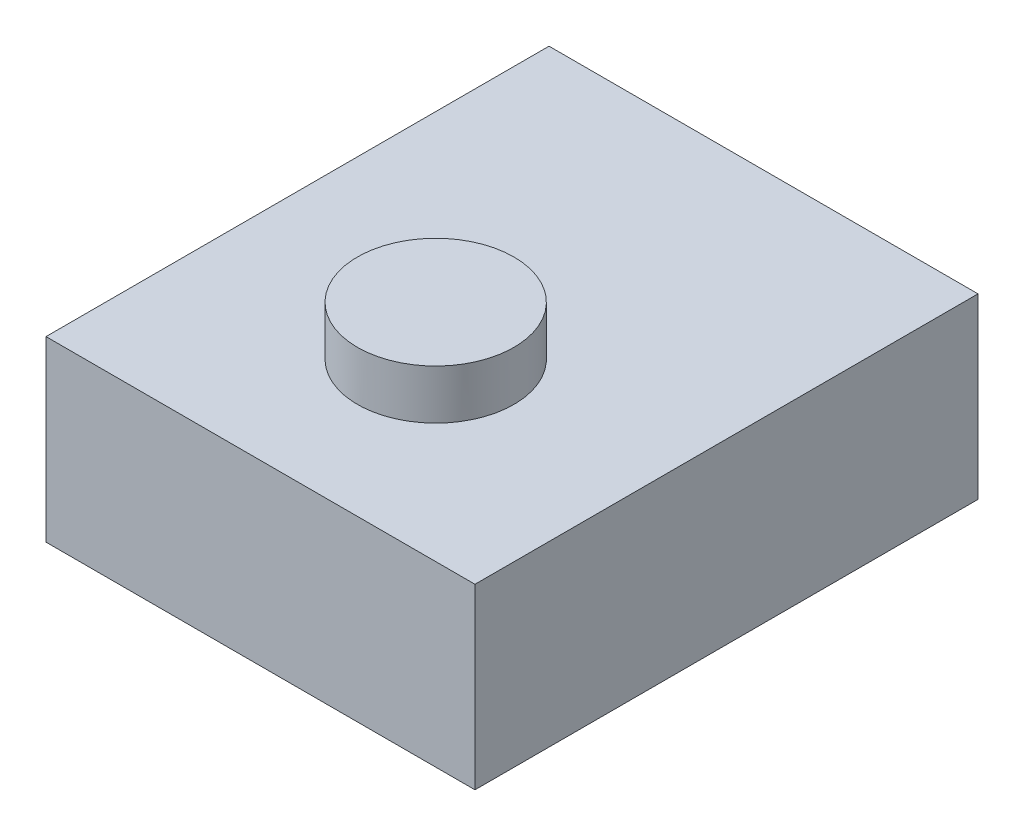
ISO-10303-21;
HEADER;
FILE_DESCRIPTION(('STEP AP214'),'2;1');
FILE_NAME('part.step','',(''),(''),'','','');
FILE_SCHEMA(('AUTOMOTIVE_DESIGN { 1 0 10303 214 1 1 1 1 }'));
ENDSEC;
DATA;
#1=APPLICATION_CONTEXT('core data for automotive mechanical design processes');
#2=APPLICATION_PROTOCOL_DEFINITION('international standard','automotive_design',2000,#1);
#3=PRODUCT_CONTEXT('',#1,'mechanical');
#4=PRODUCT('Part','Part','',(#3));
#5=PRODUCT_RELATED_PRODUCT_CATEGORY('part','',(#4));
#6=PRODUCT_DEFINITION_FORMATION('','',#4);
#7=PRODUCT_DEFINITION_CONTEXT('part definition',#1,'design');
#8=PRODUCT_DEFINITION('design','',#6,#7);
#9=PRODUCT_DEFINITION_SHAPE('','',#8);
#10=(LENGTH_UNIT() NAMED_UNIT(*) SI_UNIT(.MILLI.,.METRE.));
#11=(NAMED_UNIT(*) PLANE_ANGLE_UNIT() SI_UNIT($,.RADIAN.));
#12=(NAMED_UNIT(*) SI_UNIT($,.STERADIAN.) SOLID_ANGLE_UNIT());
#13=UNCERTAINTY_MEASURE_WITH_UNIT(LENGTH_MEASURE(1.E-05),#10,'distance_accuracy_value','');
#14=(GEOMETRIC_REPRESENTATION_CONTEXT(3) GLOBAL_UNCERTAINTY_ASSIGNED_CONTEXT((#13)) GLOBAL_UNIT_ASSIGNED_CONTEXT((#10,
#11,#12)) REPRESENTATION_CONTEXT('',''));
#15=CARTESIAN_POINT('',(0.,0.,0.));
#16=DIRECTION('',(0.,0.,1.));
#17=DIRECTION('',(1.,0.,0.));
#18=AXIS2_PLACEMENT_3D('',#15,#16,#17);
#19=CARTESIAN_POINT('',(0.,6.3,0.));
#20=DIRECTION('',(1.,0.,0.));
#21=DIRECTION('',(0.,0.,-1.));
#22=AXIS2_PLACEMENT_3D('',#19,#20,#21);
#23=PLANE('',#22);
#24=DIRECTION('',(0.,0.,1.));
#25=VECTOR('',#24,1.);
#26=CARTESIAN_POINT('',(0.,0.,0.));
#27=LINE('',#26,#25);
#28=CARTESIAN_POINT('',(0.,0.,-17.8));
#29=VERTEX_POINT('',#28);
#30=CARTESIAN_POINT('',(0.,0.,0.));
#31=VERTEX_POINT('',#30);
#32=EDGE_CURVE('E99',#29,#31,#27,.T.);
#33=ORIENTED_EDGE('',*,*,#32,.T.);
#34=DIRECTION('',(0.,-1.,0.));
#35=VECTOR('',#34,1.);
#36=CARTESIAN_POINT('',(0.,6.3,0.));
#37=LINE('',#36,#35);
#38=CARTESIAN_POINT('',(0.,6.3,0.));
#39=VERTEX_POINT('',#38);
#40=EDGE_CURVE('E41',#39,#31,#37,.T.);
#41=ORIENTED_EDGE('',*,*,#40,.F.);
#42=DIRECTION('',(0.,0.,1.));
#43=VECTOR('',#42,1.);
#44=CARTESIAN_POINT('',(0.,6.3,0.));
#45=LINE('',#44,#43);
#46=CARTESIAN_POINT('',(0.,6.3,-17.8));
#47=VERTEX_POINT('',#46);
#48=EDGE_CURVE('E85',#47,#39,#45,.T.);
#49=ORIENTED_EDGE('',*,*,#48,.F.);
#50=DIRECTION('',(0.,-1.,0.));
#51=VECTOR('',#50,1.);
#52=CARTESIAN_POINT('',(0.,6.3,-17.8));
#53=LINE('',#52,#51);
#54=EDGE_CURVE('E95',#47,#29,#53,.T.);
#55=ORIENTED_EDGE('',*,*,#54,.T.);
#56=EDGE_LOOP('',(#33,#41,#49,#55));
#57=FACE_BOUND('',#56,.T.);
#58=ADVANCED_FACE('F33',(#57),#23,.F.);
#59=CARTESIAN_POINT('',(0.,6.3,0.));
#60=DIRECTION('',(0.,0.,-1.));
#61=DIRECTION('',(-1.,0.,0.));
#62=AXIS2_PLACEMENT_3D('',#59,#60,#61);
#63=PLANE('',#62);
#64=DIRECTION('',(1.,0.,0.));
#65=VECTOR('',#64,1.);
#66=CARTESIAN_POINT('',(0.,0.,0.));
#67=LINE('',#66,#65);
#68=CARTESIAN_POINT('',(15.18,0.,0.));
#69=VERTEX_POINT('',#68);
#70=EDGE_CURVE('E90',#31,#69,#67,.T.);
#71=ORIENTED_EDGE('',*,*,#70,.T.);
#72=DIRECTION('',(0.,-1.,0.));
#73=VECTOR('',#72,1.);
#74=CARTESIAN_POINT('',(15.18,6.3,0.));
#75=LINE('',#74,#73);
#76=CARTESIAN_POINT('',(15.18,6.3,0.));
#77=VERTEX_POINT('',#76);
#78=EDGE_CURVE('E88',#77,#69,#75,.T.);
#79=ORIENTED_EDGE('',*,*,#78,.F.);
#80=DIRECTION('',(1.,0.,0.));
#81=VECTOR('',#80,1.);
#82=CARTESIAN_POINT('',(0.,6.3,0.));
#83=LINE('',#82,#81);
#84=EDGE_CURVE('E80',#39,#77,#83,.T.);
#85=ORIENTED_EDGE('',*,*,#84,.F.);
#86=ORIENTED_EDGE('',*,*,#40,.T.);
#87=EDGE_LOOP('',(#71,#79,#85,#86));
#88=FACE_BOUND('',#87,.T.);
#89=ADVANCED_FACE('F89',(#88),#63,.F.);
#90=CARTESIAN_POINT('',(15.18,6.3,0.));
#91=DIRECTION('',(-1.,0.,0.));
#92=DIRECTION('',(0.,0.,1.));
#93=AXIS2_PLACEMENT_3D('',#90,#91,#92);
#94=PLANE('',#93);
#95=DIRECTION('',(0.,0.,-1.));
#96=VECTOR('',#95,1.);
#97=CARTESIAN_POINT('',(15.18,0.,0.));
#98=LINE('',#97,#96);
#99=CARTESIAN_POINT('',(15.18,0.,-17.8));
#100=VERTEX_POINT('',#99);
#101=EDGE_CURVE('E66',#69,#100,#98,.T.);
#102=ORIENTED_EDGE('',*,*,#101,.T.);
#103=DIRECTION('',(0.,-1.,0.));
#104=VECTOR('',#103,1.);
#105=CARTESIAN_POINT('',(15.18,6.3,-17.8));
#106=LINE('',#105,#104);
#107=CARTESIAN_POINT('',(15.18,6.3,-17.8));
#108=VERTEX_POINT('',#107);
#109=EDGE_CURVE('E91',#108,#100,#106,.T.);
#110=ORIENTED_EDGE('',*,*,#109,.F.);
#111=DIRECTION('',(0.,0.,-1.));
#112=VECTOR('',#111,1.);
#113=CARTESIAN_POINT('',(15.18,6.3,0.));
#114=LINE('',#113,#112);
#115=EDGE_CURVE('E83',#77,#108,#114,.T.);
#116=ORIENTED_EDGE('',*,*,#115,.F.);
#117=ORIENTED_EDGE('',*,*,#78,.T.);
#118=EDGE_LOOP('',(#102,#110,#116,#117));
#119=FACE_BOUND('',#118,.T.);
#120=ADVANCED_FACE('F93',(#119),#94,.F.);
#121=CARTESIAN_POINT('',(0.,6.3,-17.8));
#122=DIRECTION('',(0.,0.,1.));
#123=DIRECTION('',(1.,0.,0.));
#124=AXIS2_PLACEMENT_3D('',#121,#122,#123);
#125=PLANE('',#124);
#126=DIRECTION('',(-1.,0.,0.));
#127=VECTOR('',#126,1.);
#128=CARTESIAN_POINT('',(0.,0.,-17.8));
#129=LINE('',#128,#127);
#130=EDGE_CURVE('E72',#100,#29,#129,.T.);
#131=ORIENTED_EDGE('',*,*,#130,.T.);
#132=ORIENTED_EDGE('',*,*,#54,.F.);
#133=DIRECTION('',(-1.,0.,0.));
#134=VECTOR('',#133,1.);
#135=CARTESIAN_POINT('',(0.,6.3,-17.8));
#136=LINE('',#135,#134);
#137=EDGE_CURVE('E49',#108,#47,#136,.T.);
#138=ORIENTED_EDGE('',*,*,#137,.F.);
#139=ORIENTED_EDGE('',*,*,#109,.T.);
#140=EDGE_LOOP('',(#131,#132,#138,#139));
#141=FACE_BOUND('',#140,.T.);
#142=ADVANCED_FACE('F121',(#141),#125,.F.);
#143=CARTESIAN_POINT('',(0.,6.3,0.));
#144=DIRECTION('',(0.,-1.,0.));
#145=DIRECTION('',(0.,0.,-1.));
#146=AXIS2_PLACEMENT_3D('',#143,#144,#145);
#147=PLANE('',#146);
#148=CARTESIAN_POINT('',(7.59,6.3,-6.2));
#149=DIRECTION('',(0.,-1.,0.));
#150=DIRECTION('',(0.,0.,-1.));
#151=AXIS2_PLACEMENT_3D('',#148,#149,#150);
#152=CIRCLE('',#151,2.77);
#153=CARTESIAN_POINT('',(7.59,6.3,-8.97));
#154=VERTEX_POINT('',#153);
#155=EDGE_CURVE('E11',#154,#154,#152,.F.);
#156=ORIENTED_EDGE('',*,*,#155,.F.);
#157=EDGE_LOOP('',(#156));
#158=FACE_BOUND('',#157,.T.);
#159=ORIENTED_EDGE('',*,*,#48,.T.);
#160=ORIENTED_EDGE('',*,*,#84,.T.);
#161=ORIENTED_EDGE('',*,*,#115,.T.);
#162=ORIENTED_EDGE('',*,*,#137,.T.);
#163=EDGE_LOOP('',(#159,#160,#161,#162));
#164=FACE_BOUND('',#163,.T.);
#165=ADVANCED_FACE('F81',(#158,#164),#147,.F.);
#166=CARTESIAN_POINT('',(0.,0.,0.));
#167=DIRECTION('',(0.,-1.,0.));
#168=DIRECTION('',(0.,0.,-1.));
#169=AXIS2_PLACEMENT_3D('',#166,#167,#168);
#170=PLANE('',#169);
#171=ORIENTED_EDGE('',*,*,#32,.F.);
#172=ORIENTED_EDGE('',*,*,#130,.F.);
#173=ORIENTED_EDGE('',*,*,#101,.F.);
#174=ORIENTED_EDGE('',*,*,#70,.F.);
#175=EDGE_LOOP('',(#171,#172,#173,#174));
#176=FACE_BOUND('',#175,.T.);
#177=ADVANCED_FACE('F110',(#176),#170,.T.);
#178=CARTESIAN_POINT('',(7.59,8.05,-6.2));
#179=DIRECTION('',(0.,-1.,0.));
#180=DIRECTION('',(0.,0.,-1.));
#181=AXIS2_PLACEMENT_3D('',#178,#179,#180);
#182=CYLINDRICAL_SURFACE('',#181,2.77);
#183=CARTESIAN_POINT('',(7.59,8.05,-6.2));
#184=DIRECTION('',(0.,1.,0.));
#185=DIRECTION('',(0.,0.,1.));
#186=AXIS2_PLACEMENT_3D('',#183,#184,#185);
#187=CIRCLE('',#186,2.77);
#188=CARTESIAN_POINT('',(7.59,8.05,-3.43));
#189=VERTEX_POINT('',#188);
#190=EDGE_CURVE('E102',#189,#189,#187,.T.);
#191=ORIENTED_EDGE('',*,*,#190,.F.);
#192=EDGE_LOOP('',(#191));
#193=FACE_BOUND('',#192,.T.);
#194=ORIENTED_EDGE('',*,*,#155,.T.);
#195=EDGE_LOOP('',(#194));
#196=FACE_BOUND('',#195,.T.);
#197=ADVANCED_FACE('F112',(#193,#196),#182,.T.);
#198=CARTESIAN_POINT('',(7.59,8.05,-6.2));
#199=DIRECTION('',(0.,1.,0.));
#200=DIRECTION('',(0.,0.,1.));
#201=AXIS2_PLACEMENT_3D('',#198,#199,#200);
#202=PLANE('',#201);
#203=ORIENTED_EDGE('',*,*,#190,.T.);
#204=EDGE_LOOP('',(#203));
#205=FACE_BOUND('',#204,.T.);
#206=ADVANCED_FACE('F118',(#205),#202,.T.);
#207=CLOSED_SHELL('',(#58,#89,#120,#142,#165,#177,#197,#206));
#208=MANIFOLD_SOLID_BREP('B2',#207);
#209=ADVANCED_BREP_SHAPE_REPRESENTATION('',(#18,#208),#14);
#210=SHAPE_DEFINITION_REPRESENTATION(#9,#209);
ENDSEC;
END-ISO-10303-21;
